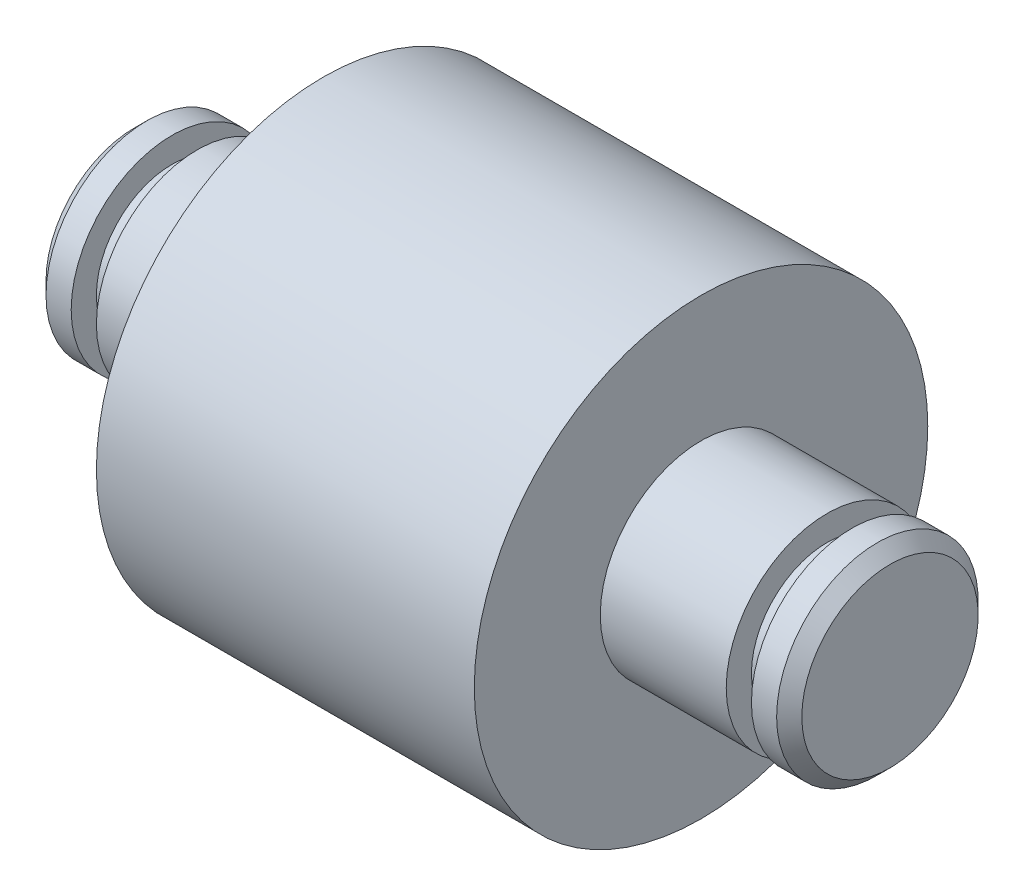
ISO-10303-21;
HEADER;
FILE_DESCRIPTION(('STEP AP214'),'2;1');
FILE_NAME('part.step','',(''),(''),'','','');
FILE_SCHEMA(('AUTOMOTIVE_DESIGN { 1 0 10303 214 1 1 1 1 }'));
ENDSEC;
DATA;
#1=APPLICATION_CONTEXT('core data for automotive mechanical design processes');
#2=APPLICATION_PROTOCOL_DEFINITION('international standard','automotive_design',2000,#1);
#3=PRODUCT_CONTEXT('',#1,'mechanical');
#4=PRODUCT('Part','Part','',(#3));
#5=PRODUCT_RELATED_PRODUCT_CATEGORY('part','',(#4));
#6=PRODUCT_DEFINITION_FORMATION('','',#4);
#7=PRODUCT_DEFINITION_CONTEXT('part definition',#1,'design');
#8=PRODUCT_DEFINITION('design','',#6,#7);
#9=PRODUCT_DEFINITION_SHAPE('','',#8);
#10=(LENGTH_UNIT() NAMED_UNIT(*) SI_UNIT(.MILLI.,.METRE.));
#11=(NAMED_UNIT(*) PLANE_ANGLE_UNIT() SI_UNIT($,.RADIAN.));
#12=(NAMED_UNIT(*) SI_UNIT($,.STERADIAN.) SOLID_ANGLE_UNIT());
#13=UNCERTAINTY_MEASURE_WITH_UNIT(LENGTH_MEASURE(1.E-05),#10,'distance_accuracy_value','');
#14=(GEOMETRIC_REPRESENTATION_CONTEXT(3) GLOBAL_UNCERTAINTY_ASSIGNED_CONTEXT((#13)) GLOBAL_UNIT_ASSIGNED_CONTEXT((#10,
#11,#12)) REPRESENTATION_CONTEXT('',''));
#15=CARTESIAN_POINT('',(0.,0.,0.));
#16=DIRECTION('',(0.,0.,1.));
#17=DIRECTION('',(1.,0.,0.));
#18=AXIS2_PLACEMENT_3D('',#15,#16,#17);
#19=CARTESIAN_POINT('',(0.,0.,0.));
#20=DIRECTION('',(1.,0.,0.));
#21=DIRECTION('',(0.,0.,-1.));
#22=AXIS2_PLACEMENT_3D('',#19,#20,#21);
#23=PLANE('',#22);
#24=CARTESIAN_POINT('',(0.,0.,0.));
#25=DIRECTION('',(-1.,0.,0.));
#26=DIRECTION('',(0.,0.,1.));
#27=AXIS2_PLACEMENT_3D('',#24,#25,#26);
#28=CIRCLE('',#27,3.5);
#29=CARTESIAN_POINT('',(0.,0.,3.5));
#30=VERTEX_POINT('',#29);
#31=EDGE_CURVE('E10',#30,#30,#28,.T.);
#32=ORIENTED_EDGE('',*,*,#31,.T.);
#33=EDGE_LOOP('',(#32));
#34=FACE_BOUND('',#33,.T.);
#35=ADVANCED_FACE('F43',(#34),#23,.F.);
#36=CARTESIAN_POINT('',(0.499999999999999,0.,0.));
#37=DIRECTION('',(1.,0.,0.));
#38=DIRECTION('',(0.,0.,-1.));
#39=AXIS2_PLACEMENT_3D('',#36,#37,#38);
#40=CONICAL_SURFACE('',#39,4.,0.78539816339745);
#41=ORIENTED_EDGE('',*,*,#31,.F.);
#42=EDGE_LOOP('',(#41));
#43=FACE_BOUND('',#42,.T.);
#44=CARTESIAN_POINT('',(0.499999999999999,0.,0.));
#45=DIRECTION('',(-1.,0.,0.));
#46=DIRECTION('',(0.,0.,1.));
#47=AXIS2_PLACEMENT_3D('',#44,#45,#46);
#48=CIRCLE('',#47,4.);
#49=CARTESIAN_POINT('',(0.499999999999999,0.,4.));
#50=VERTEX_POINT('',#49);
#51=EDGE_CURVE('E50',#50,#50,#48,.T.);
#52=ORIENTED_EDGE('',*,*,#51,.T.);
#53=EDGE_LOOP('',(#52));
#54=FACE_BOUND('',#53,.T.);
#55=ADVANCED_FACE('F127',(#43,#54),#40,.T.);
#56=CARTESIAN_POINT('',(0.,0.,0.));
#57=DIRECTION('',(-1.,0.,0.));
#58=DIRECTION('',(0.,0.,1.));
#59=AXIS2_PLACEMENT_3D('',#56,#57,#58);
#60=CYLINDRICAL_SURFACE('',#59,4.);
#61=ORIENTED_EDGE('',*,*,#51,.F.);
#62=EDGE_LOOP('',(#61));
#63=FACE_BOUND('',#62,.T.);
#64=CARTESIAN_POINT('',(1.5,0.,0.));
#65=DIRECTION('',(-1.,0.,0.));
#66=DIRECTION('',(0.,0.,1.));
#67=AXIS2_PLACEMENT_3D('',#64,#65,#66);
#68=CIRCLE('',#67,4.);
#69=CARTESIAN_POINT('',(1.5,0.,4.));
#70=VERTEX_POINT('',#69);
#71=EDGE_CURVE('E55',#70,#70,#68,.T.);
#72=ORIENTED_EDGE('',*,*,#71,.T.);
#73=EDGE_LOOP('',(#72));
#74=FACE_BOUND('',#73,.T.);
#75=ADVANCED_FACE('F131',(#63,#74),#60,.T.);
#76=CARTESIAN_POINT('',(1.5,4.,0.));
#77=DIRECTION('',(-1.,0.,0.));
#78=DIRECTION('',(0.,0.,1.));
#79=AXIS2_PLACEMENT_3D('',#76,#77,#78);
#80=PLANE('',#79);
#81=ORIENTED_EDGE('',*,*,#71,.F.);
#82=EDGE_LOOP('',(#81));
#83=FACE_BOUND('',#82,.T.);
#84=CARTESIAN_POINT('',(1.5,0.,0.));
#85=DIRECTION('',(-1.,0.,0.));
#86=DIRECTION('',(0.,0.,1.));
#87=AXIS2_PLACEMENT_3D('',#84,#85,#86);
#88=CIRCLE('',#87,3.);
#89=CARTESIAN_POINT('',(1.5,0.,3.));
#90=VERTEX_POINT('',#89);
#91=EDGE_CURVE('E60',#90,#90,#88,.T.);
#92=ORIENTED_EDGE('',*,*,#91,.T.);
#93=EDGE_LOOP('',(#92));
#94=FACE_BOUND('',#93,.T.);
#95=ADVANCED_FACE('F136',(#83,#94),#80,.F.);
#96=CARTESIAN_POINT('',(0.,0.,0.));
#97=DIRECTION('',(-1.,0.,0.));
#98=DIRECTION('',(0.,0.,1.));
#99=AXIS2_PLACEMENT_3D('',#96,#97,#98);
#100=CYLINDRICAL_SURFACE('',#99,3.);
#101=ORIENTED_EDGE('',*,*,#91,.F.);
#102=EDGE_LOOP('',(#101));
#103=FACE_BOUND('',#102,.T.);
#104=CARTESIAN_POINT('',(2.5,0.,0.));
#105=DIRECTION('',(-1.,0.,0.));
#106=DIRECTION('',(0.,0.,1.));
#107=AXIS2_PLACEMENT_3D('',#104,#105,#106);
#108=CIRCLE('',#107,3.);
#109=CARTESIAN_POINT('',(2.5,0.,3.));
#110=VERTEX_POINT('',#109);
#111=EDGE_CURVE('E66',#110,#110,#108,.T.);
#112=ORIENTED_EDGE('',*,*,#111,.T.);
#113=EDGE_LOOP('',(#112));
#114=FACE_BOUND('',#113,.T.);
#115=ADVANCED_FACE('F142',(#103,#114),#100,.T.);
#116=CARTESIAN_POINT('',(2.5,3.,0.));
#117=DIRECTION('',(1.,0.,0.));
#118=DIRECTION('',(0.,0.,-1.));
#119=AXIS2_PLACEMENT_3D('',#116,#117,#118);
#120=PLANE('',#119);
#121=ORIENTED_EDGE('',*,*,#111,.F.);
#122=EDGE_LOOP('',(#121));
#123=FACE_BOUND('',#122,.T.);
#124=CARTESIAN_POINT('',(2.5,0.,0.));
#125=DIRECTION('',(-1.,0.,0.));
#126=DIRECTION('',(0.,0.,1.));
#127=AXIS2_PLACEMENT_3D('',#124,#125,#126);
#128=CIRCLE('',#127,4.);
#129=CARTESIAN_POINT('',(2.5,0.,4.));
#130=VERTEX_POINT('',#129);
#131=EDGE_CURVE('E70',#130,#130,#128,.T.);
#132=ORIENTED_EDGE('',*,*,#131,.T.);
#133=EDGE_LOOP('',(#132));
#134=FACE_BOUND('',#133,.T.);
#135=ADVANCED_FACE('F146',(#123,#134),#120,.F.);
#136=CARTESIAN_POINT('',(0.,0.,0.));
#137=DIRECTION('',(-1.,0.,0.));
#138=DIRECTION('',(0.,0.,1.));
#139=AXIS2_PLACEMENT_3D('',#136,#137,#138);
#140=CYLINDRICAL_SURFACE('',#139,4.);
#141=ORIENTED_EDGE('',*,*,#131,.F.);
#142=EDGE_LOOP('',(#141));
#143=FACE_BOUND('',#142,.T.);
#144=CARTESIAN_POINT('',(7.5,0.,0.));
#145=DIRECTION('',(-1.,0.,0.));
#146=DIRECTION('',(0.,0.,1.));
#147=AXIS2_PLACEMENT_3D('',#144,#145,#146);
#148=CIRCLE('',#147,4.);
#149=CARTESIAN_POINT('',(7.5,0.,4.));
#150=VERTEX_POINT('',#149);
#151=EDGE_CURVE('E74',#150,#150,#148,.T.);
#152=ORIENTED_EDGE('',*,*,#151,.T.);
#153=EDGE_LOOP('',(#152));
#154=FACE_BOUND('',#153,.T.);
#155=ADVANCED_FACE('F150',(#143,#154),#140,.T.);
#156=CARTESIAN_POINT('',(7.5,4.,0.));
#157=DIRECTION('',(1.,0.,0.));
#158=DIRECTION('',(0.,0.,-1.));
#159=AXIS2_PLACEMENT_3D('',#156,#157,#158);
#160=PLANE('',#159);
#161=ORIENTED_EDGE('',*,*,#151,.F.);
#162=EDGE_LOOP('',(#161));
#163=FACE_BOUND('',#162,.T.);
#164=CARTESIAN_POINT('',(7.5,0.,0.));
#165=DIRECTION('',(-1.,0.,0.));
#166=DIRECTION('',(0.,0.,1.));
#167=AXIS2_PLACEMENT_3D('',#164,#165,#166);
#168=CIRCLE('',#167,9.);
#169=CARTESIAN_POINT('',(7.5,0.,9.));
#170=VERTEX_POINT('',#169);
#171=EDGE_CURVE('E78',#170,#170,#168,.T.);
#172=ORIENTED_EDGE('',*,*,#171,.T.);
#173=EDGE_LOOP('',(#172));
#174=FACE_BOUND('',#173,.T.);
#175=ADVANCED_FACE('F154',(#163,#174),#160,.F.);
#176=CARTESIAN_POINT('',(0.,0.,0.));
#177=DIRECTION('',(-1.,0.,0.));
#178=DIRECTION('',(0.,0.,1.));
#179=AXIS2_PLACEMENT_3D('',#176,#177,#178);
#180=CYLINDRICAL_SURFACE('',#179,9.);
#181=ORIENTED_EDGE('',*,*,#171,.F.);
#182=EDGE_LOOP('',(#181));
#183=FACE_BOUND('',#182,.T.);
#184=CARTESIAN_POINT('',(22.5,0.,0.));
#185=DIRECTION('',(-1.,0.,0.));
#186=DIRECTION('',(0.,0.,1.));
#187=AXIS2_PLACEMENT_3D('',#184,#185,#186);
#188=CIRCLE('',#187,9.);
#189=CARTESIAN_POINT('',(22.5,0.,9.));
#190=VERTEX_POINT('',#189);
#191=EDGE_CURVE('E82',#190,#190,#188,.T.);
#192=ORIENTED_EDGE('',*,*,#191,.T.);
#193=EDGE_LOOP('',(#192));
#194=FACE_BOUND('',#193,.T.);
#195=ADVANCED_FACE('F158',(#183,#194),#180,.T.);
#196=CARTESIAN_POINT('',(22.5,9.,0.));
#197=DIRECTION('',(-1.,0.,0.));
#198=DIRECTION('',(0.,0.,1.));
#199=AXIS2_PLACEMENT_3D('',#196,#197,#198);
#200=PLANE('',#199);
#201=ORIENTED_EDGE('',*,*,#191,.F.);
#202=EDGE_LOOP('',(#201));
#203=FACE_BOUND('',#202,.T.);
#204=CARTESIAN_POINT('',(22.5,0.,0.));
#205=DIRECTION('',(-1.,0.,0.));
#206=DIRECTION('',(0.,0.,1.));
#207=AXIS2_PLACEMENT_3D('',#204,#205,#206);
#208=CIRCLE('',#207,4.);
#209=CARTESIAN_POINT('',(22.5,0.,4.));
#210=VERTEX_POINT('',#209);
#211=EDGE_CURVE('E86',#210,#210,#208,.T.);
#212=ORIENTED_EDGE('',*,*,#211,.T.);
#213=EDGE_LOOP('',(#212));
#214=FACE_BOUND('',#213,.T.);
#215=ADVANCED_FACE('F162',(#203,#214),#200,.F.);
#216=CARTESIAN_POINT('',(0.,0.,0.));
#217=DIRECTION('',(-1.,0.,0.));
#218=DIRECTION('',(0.,0.,1.));
#219=AXIS2_PLACEMENT_3D('',#216,#217,#218);
#220=CYLINDRICAL_SURFACE('',#219,4.);
#221=ORIENTED_EDGE('',*,*,#211,.F.);
#222=EDGE_LOOP('',(#221));
#223=FACE_BOUND('',#222,.T.);
#224=CARTESIAN_POINT('',(27.5,0.,0.));
#225=DIRECTION('',(-1.,0.,0.));
#226=DIRECTION('',(0.,0.,1.));
#227=AXIS2_PLACEMENT_3D('',#224,#225,#226);
#228=CIRCLE('',#227,4.);
#229=CARTESIAN_POINT('',(27.5,0.,4.));
#230=VERTEX_POINT('',#229);
#231=EDGE_CURVE('E90',#230,#230,#228,.T.);
#232=ORIENTED_EDGE('',*,*,#231,.T.);
#233=EDGE_LOOP('',(#232));
#234=FACE_BOUND('',#233,.T.);
#235=ADVANCED_FACE('F166',(#223,#234),#220,.T.);
#236=CARTESIAN_POINT('',(27.5,4.,0.));
#237=DIRECTION('',(-1.,0.,0.));
#238=DIRECTION('',(0.,0.,1.));
#239=AXIS2_PLACEMENT_3D('',#236,#237,#238);
#240=PLANE('',#239);
#241=ORIENTED_EDGE('',*,*,#231,.F.);
#242=EDGE_LOOP('',(#241));
#243=FACE_BOUND('',#242,.T.);
#244=CARTESIAN_POINT('',(27.5,0.,0.));
#245=DIRECTION('',(-1.,0.,0.));
#246=DIRECTION('',(0.,0.,1.));
#247=AXIS2_PLACEMENT_3D('',#244,#245,#246);
#248=CIRCLE('',#247,3.);
#249=CARTESIAN_POINT('',(27.5,0.,3.));
#250=VERTEX_POINT('',#249);
#251=EDGE_CURVE('E94',#250,#250,#248,.T.);
#252=ORIENTED_EDGE('',*,*,#251,.T.);
#253=EDGE_LOOP('',(#252));
#254=FACE_BOUND('',#253,.T.);
#255=ADVANCED_FACE('F170',(#243,#254),#240,.F.);
#256=CARTESIAN_POINT('',(0.,0.,0.));
#257=DIRECTION('',(-1.,0.,0.));
#258=DIRECTION('',(0.,0.,1.));
#259=AXIS2_PLACEMENT_3D('',#256,#257,#258);
#260=CYLINDRICAL_SURFACE('',#259,3.);
#261=ORIENTED_EDGE('',*,*,#251,.F.);
#262=EDGE_LOOP('',(#261));
#263=FACE_BOUND('',#262,.T.);
#264=CARTESIAN_POINT('',(28.5,0.,0.));
#265=DIRECTION('',(-1.,0.,0.));
#266=DIRECTION('',(0.,0.,1.));
#267=AXIS2_PLACEMENT_3D('',#264,#265,#266);
#268=CIRCLE('',#267,3.);
#269=CARTESIAN_POINT('',(28.5,0.,3.));
#270=VERTEX_POINT('',#269);
#271=EDGE_CURVE('E98',#270,#270,#268,.T.);
#272=ORIENTED_EDGE('',*,*,#271,.T.);
#273=EDGE_LOOP('',(#272));
#274=FACE_BOUND('',#273,.T.);
#275=ADVANCED_FACE('F174',(#263,#274),#260,.T.);
#276=CARTESIAN_POINT('',(28.5,3.,0.));
#277=DIRECTION('',(1.,0.,0.));
#278=DIRECTION('',(0.,0.,-1.));
#279=AXIS2_PLACEMENT_3D('',#276,#277,#278);
#280=PLANE('',#279);
#281=ORIENTED_EDGE('',*,*,#271,.F.);
#282=EDGE_LOOP('',(#281));
#283=FACE_BOUND('',#282,.T.);
#284=CARTESIAN_POINT('',(28.5,0.,0.));
#285=DIRECTION('',(-1.,0.,0.));
#286=DIRECTION('',(0.,0.,1.));
#287=AXIS2_PLACEMENT_3D('',#284,#285,#286);
#288=CIRCLE('',#287,4.);
#289=CARTESIAN_POINT('',(28.5,0.,4.));
#290=VERTEX_POINT('',#289);
#291=EDGE_CURVE('E102',#290,#290,#288,.T.);
#292=ORIENTED_EDGE('',*,*,#291,.T.);
#293=EDGE_LOOP('',(#292));
#294=FACE_BOUND('',#293,.T.);
#295=ADVANCED_FACE('F178',(#283,#294),#280,.F.);
#296=CARTESIAN_POINT('',(0.,0.,0.));
#297=DIRECTION('',(-1.,0.,0.));
#298=DIRECTION('',(0.,0.,1.));
#299=AXIS2_PLACEMENT_3D('',#296,#297,#298);
#300=CYLINDRICAL_SURFACE('',#299,4.);
#301=ORIENTED_EDGE('',*,*,#291,.F.);
#302=EDGE_LOOP('',(#301));
#303=FACE_BOUND('',#302,.T.);
#304=CARTESIAN_POINT('',(29.5,0.,0.));
#305=DIRECTION('',(-1.,0.,0.));
#306=DIRECTION('',(0.,0.,1.));
#307=AXIS2_PLACEMENT_3D('',#304,#305,#306);
#308=CIRCLE('',#307,4.);
#309=CARTESIAN_POINT('',(29.5,0.,4.));
#310=VERTEX_POINT('',#309);
#311=EDGE_CURVE('E106',#310,#310,#308,.T.);
#312=ORIENTED_EDGE('',*,*,#311,.T.);
#313=EDGE_LOOP('',(#312));
#314=FACE_BOUND('',#313,.T.);
#315=ADVANCED_FACE('F123',(#303,#314),#300,.T.);
#316=CARTESIAN_POINT('',(30.,0.,0.));
#317=DIRECTION('',(-1.,0.,0.));
#318=DIRECTION('',(0.,0.,1.));
#319=AXIS2_PLACEMENT_3D('',#316,#317,#318);
#320=CONICAL_SURFACE('',#319,3.5,0.785398163397442);
#321=ORIENTED_EDGE('',*,*,#311,.F.);
#322=EDGE_LOOP('',(#321));
#323=FACE_BOUND('',#322,.T.);
#324=CARTESIAN_POINT('',(30.,0.,0.));
#325=DIRECTION('',(-1.,0.,0.));
#326=DIRECTION('',(0.,0.,1.));
#327=AXIS2_PLACEMENT_3D('',#324,#325,#326);
#328=CIRCLE('',#327,3.5);
#329=CARTESIAN_POINT('',(30.,0.,3.5));
#330=VERTEX_POINT('',#329);
#331=EDGE_CURVE('E110',#330,#330,#328,.T.);
#332=ORIENTED_EDGE('',*,*,#331,.T.);
#333=EDGE_LOOP('',(#332));
#334=FACE_BOUND('',#333,.T.);
#335=ADVANCED_FACE('F115',(#323,#334),#320,.T.);
#336=CARTESIAN_POINT('',(30.,3.5,0.));
#337=DIRECTION('',(-1.,0.,0.));
#338=DIRECTION('',(0.,0.,1.));
#339=AXIS2_PLACEMENT_3D('',#336,#337,#338);
#340=PLANE('',#339);
#341=ORIENTED_EDGE('',*,*,#331,.F.);
#342=EDGE_LOOP('',(#341));
#343=FACE_BOUND('',#342,.T.);
#344=ADVANCED_FACE('F117',(#343),#340,.F.);
#345=CLOSED_SHELL('',(#35,#55,#75,#95,#115,#135,#155,#175,#195,#215,#235,#255,#275,#295,#315,
#335,#344));
#346=MANIFOLD_SOLID_BREP('B2',#345);
#347=ADVANCED_BREP_SHAPE_REPRESENTATION('',(#18,#346),#14);
#348=SHAPE_DEFINITION_REPRESENTATION(#9,#347);
ENDSEC;
END-ISO-10303-21;
